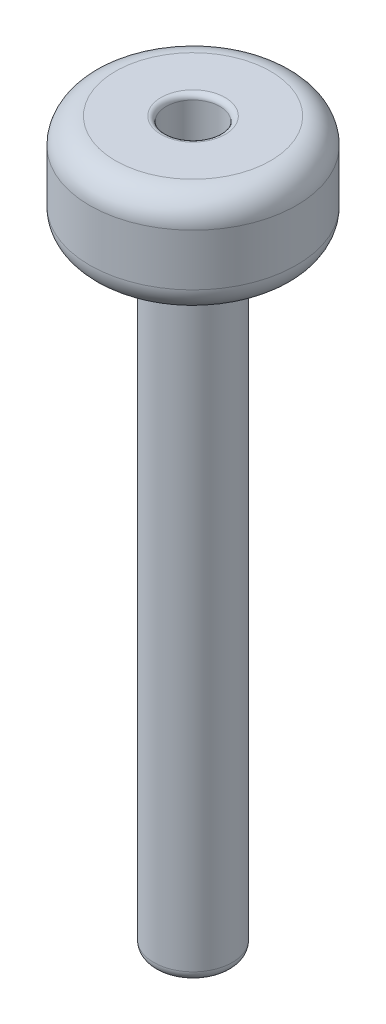
ISO-10303-21;
HEADER;
FILE_DESCRIPTION(('STEP AP214'),'2;1');
FILE_NAME('part.step','',(''),(''),'','','');
FILE_SCHEMA(('AUTOMOTIVE_DESIGN { 1 0 10303 214 1 1 1 1 }'));
ENDSEC;
DATA;
#1=APPLICATION_CONTEXT('core data for automotive mechanical design processes');
#2=APPLICATION_PROTOCOL_DEFINITION('international standard','automotive_design',2000,#1);
#3=PRODUCT_CONTEXT('',#1,'mechanical');
#4=PRODUCT('Part','Part','',(#3));
#5=PRODUCT_RELATED_PRODUCT_CATEGORY('part','',(#4));
#6=PRODUCT_DEFINITION_FORMATION('','',#4);
#7=PRODUCT_DEFINITION_CONTEXT('part definition',#1,'design');
#8=PRODUCT_DEFINITION('design','',#6,#7);
#9=PRODUCT_DEFINITION_SHAPE('','',#8);
#10=(LENGTH_UNIT() NAMED_UNIT(*) SI_UNIT(.MILLI.,.METRE.));
#11=(NAMED_UNIT(*) PLANE_ANGLE_UNIT() SI_UNIT($,.RADIAN.));
#12=(NAMED_UNIT(*) SI_UNIT($,.STERADIAN.) SOLID_ANGLE_UNIT());
#13=UNCERTAINTY_MEASURE_WITH_UNIT(LENGTH_MEASURE(1.E-05),#10,'distance_accuracy_value','');
#14=(GEOMETRIC_REPRESENTATION_CONTEXT(3) GLOBAL_UNCERTAINTY_ASSIGNED_CONTEXT((#13)) GLOBAL_UNIT_ASSIGNED_CONTEXT((#10,
#11,#12)) REPRESENTATION_CONTEXT('',''));
#15=CARTESIAN_POINT('',(0.,0.,0.));
#16=DIRECTION('',(0.,0.,1.));
#17=DIRECTION('',(1.,0.,0.));
#18=AXIS2_PLACEMENT_3D('',#15,#16,#17);
#19=CARTESIAN_POINT('',(0.,0.,0.));
#20=DIRECTION('',(0.,1.,0.));
#21=DIRECTION('',(0.,0.,1.));
#22=AXIS2_PLACEMENT_3D('',#19,#20,#21);
#23=PLANE('',#22);
#24=CARTESIAN_POINT('',(0.,0.,0.));
#25=DIRECTION('',(0.,1.,0.));
#26=DIRECTION('',(0.,0.,1.));
#27=AXIS2_PLACEMENT_3D('',#24,#25,#26);
#28=CIRCLE('',#27,5.6);
#29=CARTESIAN_POINT('',(0.,0.,5.6));
#30=VERTEX_POINT('',#29);
#31=EDGE_CURVE('E52',#30,#30,#28,.F.);
#32=ORIENTED_EDGE('',*,*,#31,.T.);
#33=EDGE_LOOP('',(#32));
#34=FACE_BOUND('',#33,.T.);
#35=CARTESIAN_POINT('',(0.,0.,0.));
#36=DIRECTION('',(0.,1.,0.));
#37=DIRECTION('',(0.,0.,1.));
#38=AXIS2_PLACEMENT_3D('',#35,#36,#37);
#39=CIRCLE('',#38,5.2);
#40=CARTESIAN_POINT('',(0.,0.,5.2));
#41=VERTEX_POINT('',#40);
#42=EDGE_CURVE('E87',#41,#41,#39,.T.);
#43=ORIENTED_EDGE('',*,*,#42,.T.);
#44=EDGE_LOOP('',(#43));
#45=FACE_BOUND('',#44,.T.);
#46=ADVANCED_FACE('F39',(#34,#45),#23,.F.);
#47=CARTESIAN_POINT('',(0.,120.,0.));
#48=DIRECTION('',(0.,-1.,0.));
#49=DIRECTION('',(0.,0.,-1.));
#50=AXIS2_PLACEMENT_3D('',#47,#48,#49);
#51=CYLINDRICAL_SURFACE('',#50,7.6);
#52=CARTESIAN_POINT('',(0.,118.,0.));
#53=DIRECTION('',(0.,1.,0.));
#54=DIRECTION('',(0.,0.,1.));
#55=AXIS2_PLACEMENT_3D('',#52,#53,#54);
#56=CIRCLE('',#55,7.6);
#57=CARTESIAN_POINT('',(0.,118.,7.6));
#58=VERTEX_POINT('',#57);
#59=EDGE_CURVE('E57',#58,#58,#56,.F.);
#60=ORIENTED_EDGE('',*,*,#59,.T.);
#61=EDGE_LOOP('',(#60));
#62=FACE_BOUND('',#61,.T.);
#63=CARTESIAN_POINT('',(0.,2.,0.));
#64=DIRECTION('',(0.,1.,0.));
#65=DIRECTION('',(0.,0.,1.));
#66=AXIS2_PLACEMENT_3D('',#63,#64,#65);
#67=CIRCLE('',#66,7.6);
#68=CARTESIAN_POINT('',(0.,2.,7.6));
#69=VERTEX_POINT('',#68);
#70=EDGE_CURVE('E63',#69,#69,#67,.T.);
#71=ORIENTED_EDGE('',*,*,#70,.T.);
#72=EDGE_LOOP('',(#71));
#73=FACE_BOUND('',#72,.T.);
#74=ADVANCED_FACE('F96',(#62,#73),#51,.T.);
#75=CARTESIAN_POINT('',(0.,120.,0.));
#76=DIRECTION('',(0.,-1.,0.));
#77=DIRECTION('',(0.,0.,-1.));
#78=AXIS2_PLACEMENT_3D('',#75,#76,#77);
#79=CYLINDRICAL_SURFACE('',#78,5.2);
#80=CARTESIAN_POINT('',(0.,139.,0.));
#81=DIRECTION('',(0.,1.,0.));
#82=DIRECTION('',(0.,0.,1.));
#83=AXIS2_PLACEMENT_3D('',#80,#81,#82);
#84=CIRCLE('',#83,5.2);
#85=CARTESIAN_POINT('',(0.,139.,5.2));
#86=VERTEX_POINT('',#85);
#87=EDGE_CURVE('E47',#86,#86,#84,.T.);
#88=ORIENTED_EDGE('',*,*,#87,.T.);
#89=EDGE_LOOP('',(#88));
#90=FACE_BOUND('',#89,.T.);
#91=ORIENTED_EDGE('',*,*,#42,.F.);
#92=EDGE_LOOP('',(#91));
#93=FACE_BOUND('',#92,.T.);
#94=ADVANCED_FACE('F93',(#90,#93),#79,.F.);
#95=CARTESIAN_POINT('',(0.,140.,0.));
#96=DIRECTION('',(0.,-1.,0.));
#97=DIRECTION('',(0.,0.,-1.));
#98=AXIS2_PLACEMENT_3D('',#95,#96,#97);
#99=CYLINDRICAL_SURFACE('',#98,20.);
#100=CARTESIAN_POINT('',(0.,125.,0.));
#101=DIRECTION('',(0.,1.,0.));
#102=DIRECTION('',(0.,0.,1.));
#103=AXIS2_PLACEMENT_3D('',#100,#101,#102);
#104=CIRCLE('',#103,20.);
#105=CARTESIAN_POINT('',(0.,125.,20.));
#106=VERTEX_POINT('',#105);
#107=EDGE_CURVE('E79',#106,#106,#104,.T.);
#108=ORIENTED_EDGE('',*,*,#107,.T.);
#109=EDGE_LOOP('',(#108));
#110=FACE_BOUND('',#109,.T.);
#111=CARTESIAN_POINT('',(0.,135.,0.));
#112=DIRECTION('',(0.,1.,0.));
#113=DIRECTION('',(0.,0.,1.));
#114=AXIS2_PLACEMENT_3D('',#111,#112,#113);
#115=CIRCLE('',#114,20.);
#116=CARTESIAN_POINT('',(0.,135.,20.));
#117=VERTEX_POINT('',#116);
#118=EDGE_CURVE('E83',#117,#117,#115,.F.);
#119=ORIENTED_EDGE('',*,*,#118,.T.);
#120=EDGE_LOOP('',(#119));
#121=FACE_BOUND('',#120,.T.);
#122=ADVANCED_FACE('F95',(#110,#121),#99,.T.);
#123=CARTESIAN_POINT('',(0.,140.,0.));
#124=DIRECTION('',(0.,1.,0.));
#125=DIRECTION('',(0.,0.,1.));
#126=AXIS2_PLACEMENT_3D('',#123,#124,#125);
#127=PLANE('',#126);
#128=CARTESIAN_POINT('',(0.,140.,0.));
#129=DIRECTION('',(0.,1.,0.));
#130=DIRECTION('',(0.,0.,1.));
#131=AXIS2_PLACEMENT_3D('',#128,#129,#130);
#132=CIRCLE('',#131,6.2);
#133=CARTESIAN_POINT('',(0.,140.,6.2));
#134=VERTEX_POINT('',#133);
#135=EDGE_CURVE('E10',#134,#134,#132,.F.);
#136=ORIENTED_EDGE('',*,*,#135,.T.);
#137=EDGE_LOOP('',(#136));
#138=FACE_BOUND('',#137,.T.);
#139=CARTESIAN_POINT('',(0.,140.,0.));
#140=DIRECTION('',(0.,1.,0.));
#141=DIRECTION('',(0.,0.,1.));
#142=AXIS2_PLACEMENT_3D('',#139,#140,#141);
#143=CIRCLE('',#142,15.);
#144=CARTESIAN_POINT('',(0.,140.,15.));
#145=VERTEX_POINT('',#144);
#146=EDGE_CURVE('E71',#145,#145,#143,.T.);
#147=ORIENTED_EDGE('',*,*,#146,.T.);
#148=EDGE_LOOP('',(#147));
#149=FACE_BOUND('',#148,.T.);
#150=ADVANCED_FACE('F102',(#138,#149),#127,.T.);
#151=CARTESIAN_POINT('',(0.,120.,0.));
#152=DIRECTION('',(0.,1.,0.));
#153=DIRECTION('',(0.,0.,1.));
#154=AXIS2_PLACEMENT_3D('',#151,#152,#153);
#155=PLANE('',#154);
#156=CARTESIAN_POINT('',(0.,120.,0.));
#157=DIRECTION('',(0.,1.,0.));
#158=DIRECTION('',(0.,0.,1.));
#159=AXIS2_PLACEMENT_3D('',#156,#157,#158);
#160=CIRCLE('',#159,9.6);
#161=CARTESIAN_POINT('',(0.,120.,9.6));
#162=VERTEX_POINT('',#161);
#163=EDGE_CURVE('E67',#162,#162,#160,.T.);
#164=ORIENTED_EDGE('',*,*,#163,.T.);
#165=EDGE_LOOP('',(#164));
#166=FACE_BOUND('',#165,.T.);
#167=CARTESIAN_POINT('',(0.,120.,0.));
#168=DIRECTION('',(0.,1.,0.));
#169=DIRECTION('',(0.,0.,1.));
#170=AXIS2_PLACEMENT_3D('',#167,#168,#169);
#171=CIRCLE('',#170,15.);
#172=CARTESIAN_POINT('',(0.,120.,15.));
#173=VERTEX_POINT('',#172);
#174=EDGE_CURVE('E75',#173,#173,#171,.F.);
#175=ORIENTED_EDGE('',*,*,#174,.T.);
#176=EDGE_LOOP('',(#175));
#177=FACE_BOUND('',#176,.T.);
#178=ADVANCED_FACE('F117',(#166,#177),#155,.F.);
#179=CARTESIAN_POINT('',(0.,125.,0.));
#180=DIRECTION('',(0.,1.,0.));
#181=DIRECTION('',(0.,0.,1.));
#182=AXIS2_PLACEMENT_3D('',#179,#180,#181);
#183=TOROIDAL_SURFACE('',#182,15.,5.);
#184=ORIENTED_EDGE('',*,*,#174,.F.);
#185=EDGE_LOOP('',(#184));
#186=FACE_BOUND('',#185,.T.);
#187=ORIENTED_EDGE('',*,*,#107,.F.);
#188=EDGE_LOOP('',(#187));
#189=FACE_BOUND('',#188,.T.);
#190=ADVANCED_FACE('F113',(#186,#189),#183,.T.);
#191=CARTESIAN_POINT('',(0.,135.,0.));
#192=DIRECTION('',(0.,1.,0.));
#193=DIRECTION('',(0.,0.,1.));
#194=AXIS2_PLACEMENT_3D('',#191,#192,#193);
#195=TOROIDAL_SURFACE('',#194,15.,5.);
#196=ORIENTED_EDGE('',*,*,#118,.F.);
#197=EDGE_LOOP('',(#196));
#198=FACE_BOUND('',#197,.T.);
#199=ORIENTED_EDGE('',*,*,#146,.F.);
#200=EDGE_LOOP('',(#199));
#201=FACE_BOUND('',#200,.T.);
#202=ADVANCED_FACE('F116',(#198,#201),#195,.T.);
#203=CARTESIAN_POINT('',(0.,118.,0.));
#204=DIRECTION('',(0.,1.,0.));
#205=DIRECTION('',(0.,0.,1.));
#206=AXIS2_PLACEMENT_3D('',#203,#204,#205);
#207=TOROIDAL_SURFACE('',#206,9.6,2.);
#208=ORIENTED_EDGE('',*,*,#59,.F.);
#209=EDGE_LOOP('',(#208));
#210=FACE_BOUND('',#209,.T.);
#211=ORIENTED_EDGE('',*,*,#163,.F.);
#212=EDGE_LOOP('',(#211));
#213=FACE_BOUND('',#212,.T.);
#214=ADVANCED_FACE('F121',(#210,#213),#207,.F.);
#215=CARTESIAN_POINT('',(0.,2.,0.));
#216=DIRECTION('',(0.,1.,0.));
#217=DIRECTION('',(0.,0.,1.));
#218=AXIS2_PLACEMENT_3D('',#215,#216,#217);
#219=TOROIDAL_SURFACE('',#218,5.6,2.);
#220=ORIENTED_EDGE('',*,*,#31,.F.);
#221=EDGE_LOOP('',(#220));
#222=FACE_BOUND('',#221,.T.);
#223=ORIENTED_EDGE('',*,*,#70,.F.);
#224=EDGE_LOOP('',(#223));
#225=FACE_BOUND('',#224,.T.);
#226=ADVANCED_FACE('F124',(#222,#225),#219,.T.);
#227=CARTESIAN_POINT('',(0.,139.,0.));
#228=DIRECTION('',(0.,1.,0.));
#229=DIRECTION('',(0.,0.,1.));
#230=AXIS2_PLACEMENT_3D('',#227,#228,#229);
#231=TOROIDAL_SURFACE('',#230,6.2,1.);
#232=ORIENTED_EDGE('',*,*,#135,.F.);
#233=EDGE_LOOP('',(#232));
#234=FACE_BOUND('',#233,.T.);
#235=ORIENTED_EDGE('',*,*,#87,.F.);
#236=EDGE_LOOP('',(#235));
#237=FACE_BOUND('',#236,.T.);
#238=ADVANCED_FACE('F41',(#234,#237),#231,.T.);
#239=CLOSED_SHELL('',(#46,#74,#94,#122,#150,#178,#190,#202,#214,#226,#238));
#240=MANIFOLD_SOLID_BREP('B2',#239);
#241=ADVANCED_BREP_SHAPE_REPRESENTATION('',(#18,#240),#14);
#242=SHAPE_DEFINITION_REPRESENTATION(#9,#241);
ENDSEC;
END-ISO-10303-21;
